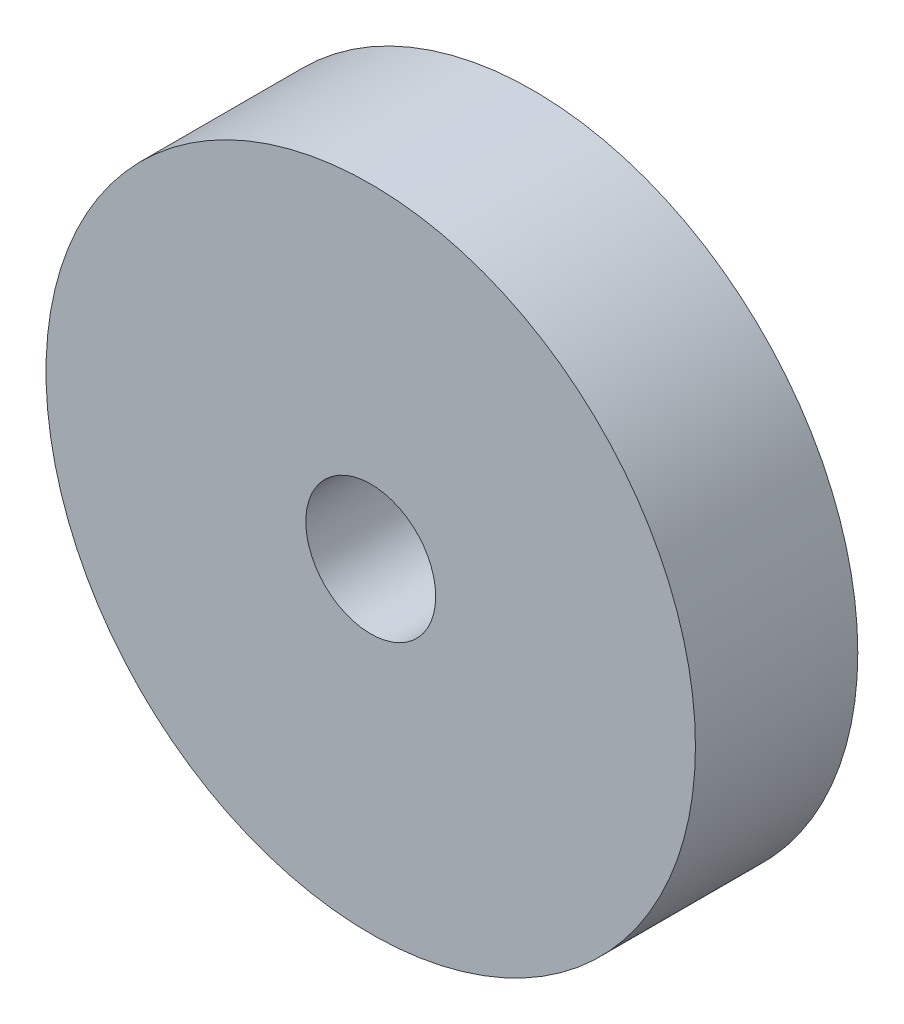
ISO-10303-21;
HEADER;
FILE_DESCRIPTION(('STEP AP214'),'2;1');
FILE_NAME('part.step','',(''),(''),'','','');
FILE_SCHEMA(('AUTOMOTIVE_DESIGN { 1 0 10303 214 1 1 1 1 }'));
ENDSEC;
DATA;
#1=APPLICATION_CONTEXT('core data for automotive mechanical design processes');
#2=APPLICATION_PROTOCOL_DEFINITION('international standard','automotive_design',2000,#1);
#3=PRODUCT_CONTEXT('',#1,'mechanical');
#4=PRODUCT('Part','Part','',(#3));
#5=PRODUCT_RELATED_PRODUCT_CATEGORY('part','',(#4));
#6=PRODUCT_DEFINITION_FORMATION('','',#4);
#7=PRODUCT_DEFINITION_CONTEXT('part definition',#1,'design');
#8=PRODUCT_DEFINITION('design','',#6,#7);
#9=PRODUCT_DEFINITION_SHAPE('','',#8);
#10=(LENGTH_UNIT() NAMED_UNIT(*) SI_UNIT(.MILLI.,.METRE.));
#11=(NAMED_UNIT(*) PLANE_ANGLE_UNIT() SI_UNIT($,.RADIAN.));
#12=(NAMED_UNIT(*) SI_UNIT($,.STERADIAN.) SOLID_ANGLE_UNIT());
#13=UNCERTAINTY_MEASURE_WITH_UNIT(LENGTH_MEASURE(1.E-05),#10,'distance_accuracy_value','');
#14=(GEOMETRIC_REPRESENTATION_CONTEXT(3) GLOBAL_UNCERTAINTY_ASSIGNED_CONTEXT((#13)) GLOBAL_UNIT_ASSIGNED_CONTEXT((#10,
#11,#12)) REPRESENTATION_CONTEXT('',''));
#15=CARTESIAN_POINT('',(0.,0.,0.));
#16=DIRECTION('',(0.,0.,1.));
#17=DIRECTION('',(1.,0.,0.));
#18=AXIS2_PLACEMENT_3D('',#15,#16,#17);
#19=CARTESIAN_POINT('',(0.,0.,2.5));
#20=DIRECTION('',(0.,0.,1.));
#21=DIRECTION('',(1.,0.,0.));
#22=AXIS2_PLACEMENT_3D('',#19,#20,#21);
#23=PLANE('',#22);
#24=CARTESIAN_POINT('',(0.,0.,2.5));
#25=DIRECTION('',(0.,0.,1.));
#26=DIRECTION('',(1.,0.,0.));
#27=AXIS2_PLACEMENT_3D('',#24,#25,#26);
#28=CIRCLE('',#27,5.);
#29=CARTESIAN_POINT('',(5.,0.,2.5));
#30=VERTEX_POINT('',#29);
#31=EDGE_CURVE('E10',#30,#30,#28,.T.);
#32=ORIENTED_EDGE('',*,*,#31,.T.);
#33=EDGE_LOOP('',(#32));
#34=FACE_BOUND('',#33,.T.);
#35=CARTESIAN_POINT('',(0.,0.,2.5));
#36=DIRECTION('',(0.,0.,1.));
#37=DIRECTION('',(1.,0.,0.));
#38=AXIS2_PLACEMENT_3D('',#35,#36,#37);
#39=CIRCLE('',#38,1.);
#40=CARTESIAN_POINT('',(1.,0.,2.5));
#41=VERTEX_POINT('',#40);
#42=EDGE_CURVE('E42',#41,#41,#39,.T.);
#43=ORIENTED_EDGE('',*,*,#42,.F.);
#44=EDGE_LOOP('',(#43));
#45=FACE_BOUND('',#44,.T.);
#46=ADVANCED_FACE('F31',(#34,#45),#23,.T.);
#47=CARTESIAN_POINT('',(0.,0.,0.));
#48=DIRECTION('',(0.,0.,1.));
#49=DIRECTION('',(1.,0.,0.));
#50=AXIS2_PLACEMENT_3D('',#47,#48,#49);
#51=PLANE('',#50);
#52=CARTESIAN_POINT('',(0.,0.,0.));
#53=DIRECTION('',(0.,0.,1.));
#54=DIRECTION('',(1.,0.,0.));
#55=AXIS2_PLACEMENT_3D('',#52,#53,#54);
#56=CIRCLE('',#55,5.);
#57=CARTESIAN_POINT('',(5.,0.,0.));
#58=VERTEX_POINT('',#57);
#59=EDGE_CURVE('E35',#58,#58,#56,.T.);
#60=ORIENTED_EDGE('',*,*,#59,.F.);
#61=EDGE_LOOP('',(#60));
#62=FACE_BOUND('',#61,.T.);
#63=CARTESIAN_POINT('',(0.,0.,0.));
#64=DIRECTION('',(0.,0.,1.));
#65=DIRECTION('',(1.,0.,0.));
#66=AXIS2_PLACEMENT_3D('',#63,#64,#65);
#67=CIRCLE('',#66,1.);
#68=CARTESIAN_POINT('',(1.,0.,0.));
#69=VERTEX_POINT('',#68);
#70=EDGE_CURVE('E44',#69,#69,#67,.T.);
#71=ORIENTED_EDGE('',*,*,#70,.T.);
#72=EDGE_LOOP('',(#71));
#73=FACE_BOUND('',#72,.T.);
#74=ADVANCED_FACE('F54',(#62,#73),#51,.F.);
#75=CARTESIAN_POINT('',(0.,0.,2.5));
#76=DIRECTION('',(0.,0.,-1.));
#77=DIRECTION('',(-1.,0.,0.));
#78=AXIS2_PLACEMENT_3D('',#75,#76,#77);
#79=CYLINDRICAL_SURFACE('',#78,5.);
#80=ORIENTED_EDGE('',*,*,#31,.F.);
#81=EDGE_LOOP('',(#80));
#82=FACE_BOUND('',#81,.T.);
#83=ORIENTED_EDGE('',*,*,#59,.T.);
#84=EDGE_LOOP('',(#83));
#85=FACE_BOUND('',#84,.T.);
#86=ADVANCED_FACE('F33',(#82,#85),#79,.T.);
#87=CARTESIAN_POINT('',(0.,0.,2.5));
#88=DIRECTION('',(0.,0.,-1.));
#89=DIRECTION('',(-1.,0.,0.));
#90=AXIS2_PLACEMENT_3D('',#87,#88,#89);
#91=CYLINDRICAL_SURFACE('',#90,1.);
#92=ORIENTED_EDGE('',*,*,#42,.T.);
#93=EDGE_LOOP('',(#92));
#94=FACE_BOUND('',#93,.T.);
#95=ORIENTED_EDGE('',*,*,#70,.F.);
#96=EDGE_LOOP('',(#95));
#97=FACE_BOUND('',#96,.T.);
#98=ADVANCED_FACE('F50',(#94,#97),#91,.F.);
#99=CLOSED_SHELL('',(#46,#74,#86,#98));
#100=MANIFOLD_SOLID_BREP('B2',#99);
#101=ADVANCED_BREP_SHAPE_REPRESENTATION('',(#18,#100),#14);
#102=SHAPE_DEFINITION_REPRESENTATION(#9,#101);
ENDSEC;
END-ISO-10303-21;
